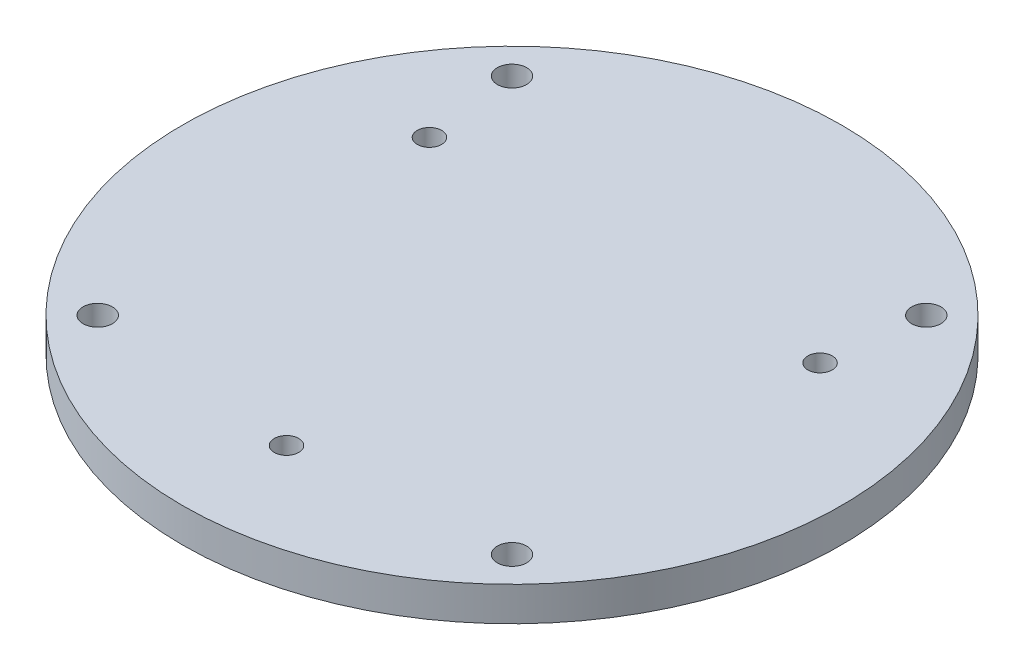
ISO-10303-21;
HEADER;
FILE_DESCRIPTION(('STEP AP214'),'2;1');
FILE_NAME('part.step','',(''),(''),'','','');
FILE_SCHEMA(('AUTOMOTIVE_DESIGN { 1 0 10303 214 1 1 1 1 }'));
ENDSEC;
DATA;
#1=APPLICATION_CONTEXT('core data for automotive mechanical design processes');
#2=APPLICATION_PROTOCOL_DEFINITION('international standard','automotive_design',2000,#1);
#3=PRODUCT_CONTEXT('',#1,'mechanical');
#4=PRODUCT('Part','Part','',(#3));
#5=PRODUCT_RELATED_PRODUCT_CATEGORY('part','',(#4));
#6=PRODUCT_DEFINITION_FORMATION('','',#4);
#7=PRODUCT_DEFINITION_CONTEXT('part definition',#1,'design');
#8=PRODUCT_DEFINITION('design','',#6,#7);
#9=PRODUCT_DEFINITION_SHAPE('','',#8);
#10=(LENGTH_UNIT() NAMED_UNIT(*) SI_UNIT(.MILLI.,.METRE.));
#11=(NAMED_UNIT(*) PLANE_ANGLE_UNIT() SI_UNIT($,.RADIAN.));
#12=(NAMED_UNIT(*) SI_UNIT($,.STERADIAN.) SOLID_ANGLE_UNIT());
#13=UNCERTAINTY_MEASURE_WITH_UNIT(LENGTH_MEASURE(1.E-05),#10,'distance_accuracy_value','');
#14=(GEOMETRIC_REPRESENTATION_CONTEXT(3) GLOBAL_UNCERTAINTY_ASSIGNED_CONTEXT((#13)) GLOBAL_UNIT_ASSIGNED_CONTEXT((#10,
#11,#12)) REPRESENTATION_CONTEXT('',''));
#15=CARTESIAN_POINT('',(0.,0.,0.));
#16=DIRECTION('',(0.,0.,1.));
#17=DIRECTION('',(1.,0.,0.));
#18=AXIS2_PLACEMENT_3D('',#15,#16,#17);
#19=CARTESIAN_POINT('',(0.,7.,0.));
#20=DIRECTION('',(0.,1.,0.));
#21=DIRECTION('',(0.,0.,1.));
#22=AXIS2_PLACEMENT_3D('',#19,#20,#21);
#23=PLANE('',#22);
#24=CARTESIAN_POINT('',(42.425,7.,42.425));
#25=DIRECTION('',(0.,1.,0.));
#26=DIRECTION('',(0.,0.,1.));
#27=AXIS2_PLACEMENT_3D('',#24,#25,#26);
#28=CIRCLE('',#27,3.);
#29=CARTESIAN_POINT('',(42.425,7.,45.425));
#30=VERTEX_POINT('',#29);
#31=EDGE_CURVE('E87',#30,#30,#28,.T.);
#32=ORIENTED_EDGE('',*,*,#31,.F.);
#33=EDGE_LOOP('',(#32));
#34=FACE_BOUND('',#33,.T.);
#35=CARTESIAN_POINT('',(-42.425,7.,42.425));
#36=DIRECTION('',(0.,1.,0.));
#37=DIRECTION('',(0.,0.,1.));
#38=AXIS2_PLACEMENT_3D('',#35,#36,#37);
#39=CIRCLE('',#38,3.);
#40=CARTESIAN_POINT('',(-42.425,7.,45.425));
#41=VERTEX_POINT('',#40);
#42=EDGE_CURVE('E84',#41,#41,#39,.T.);
#43=ORIENTED_EDGE('',*,*,#42,.F.);
#44=EDGE_LOOP('',(#43));
#45=FACE_BOUND('',#44,.T.);
#46=CARTESIAN_POINT('',(-42.425,7.,-42.425));
#47=DIRECTION('',(0.,1.,0.));
#48=DIRECTION('',(0.,0.,1.));
#49=AXIS2_PLACEMENT_3D('',#46,#47,#48);
#50=CIRCLE('',#49,3.);
#51=CARTESIAN_POINT('',(-42.425,7.,-39.425));
#52=VERTEX_POINT('',#51);
#53=EDGE_CURVE('E77',#52,#52,#50,.T.);
#54=ORIENTED_EDGE('',*,*,#53,.F.);
#55=EDGE_LOOP('',(#54));
#56=FACE_BOUND('',#55,.T.);
#57=CARTESIAN_POINT('',(42.425,7.,-42.425));
#58=DIRECTION('',(0.,1.,0.));
#59=DIRECTION('',(0.,0.,1.));
#60=AXIS2_PLACEMENT_3D('',#57,#58,#59);
#61=CIRCLE('',#60,3.);
#62=CARTESIAN_POINT('',(42.425,7.,-39.425));
#63=VERTEX_POINT('',#62);
#64=EDGE_CURVE('E73',#63,#63,#61,.T.);
#65=ORIENTED_EDGE('',*,*,#64,.F.);
#66=EDGE_LOOP('',(#65));
#67=FACE_BOUND('',#66,.T.);
#68=CARTESIAN_POINT('',(40.,7.,-23.0940107675853));
#69=DIRECTION('',(0.,1.,0.));
#70=DIRECTION('',(0.,0.,1.));
#71=AXIS2_PLACEMENT_3D('',#68,#69,#70);
#72=CIRCLE('',#71,2.5);
#73=CARTESIAN_POINT('',(40.,7.,-20.5940107675853));
#74=VERTEX_POINT('',#73);
#75=EDGE_CURVE('E62',#74,#74,#72,.T.);
#76=ORIENTED_EDGE('',*,*,#75,.F.);
#77=EDGE_LOOP('',(#76));
#78=FACE_BOUND('',#77,.T.);
#79=CARTESIAN_POINT('',(0.,7.,0.));
#80=DIRECTION('',(0.,1.,0.));
#81=DIRECTION('',(0.,0.,1.));
#82=AXIS2_PLACEMENT_3D('',#79,#80,#81);
#83=CIRCLE('',#82,67.5);
#84=CARTESIAN_POINT('',(0.,7.,67.5));
#85=VERTEX_POINT('',#84);
#86=EDGE_CURVE('E11',#85,#85,#83,.T.);
#87=ORIENTED_EDGE('',*,*,#86,.T.);
#88=EDGE_LOOP('',(#87));
#89=FACE_BOUND('',#88,.T.);
#90=CARTESIAN_POINT('',(-40.,7.,-23.0940107675853));
#91=DIRECTION('',(0.,1.,0.));
#92=DIRECTION('',(0.,0.,1.));
#93=AXIS2_PLACEMENT_3D('',#90,#91,#92);
#94=CIRCLE('',#93,2.5);
#95=CARTESIAN_POINT('',(-40.,7.,-20.5940107675853));
#96=VERTEX_POINT('',#95);
#97=EDGE_CURVE('E46',#96,#96,#94,.T.);
#98=ORIENTED_EDGE('',*,*,#97,.F.);
#99=EDGE_LOOP('',(#98));
#100=FACE_BOUND('',#99,.T.);
#101=CARTESIAN_POINT('',(0.,7.,46.1880215351698));
#102=DIRECTION('',(0.,1.,0.));
#103=DIRECTION('',(0.,0.,1.));
#104=AXIS2_PLACEMENT_3D('',#101,#102,#103);
#105=CIRCLE('',#104,2.5);
#106=CARTESIAN_POINT('',(0.,7.,48.6880215351698));
#107=VERTEX_POINT('',#106);
#108=EDGE_CURVE('E63',#107,#107,#105,.T.);
#109=ORIENTED_EDGE('',*,*,#108,.F.);
#110=EDGE_LOOP('',(#109));
#111=FACE_BOUND('',#110,.T.);
#112=ADVANCED_FACE('F33',(#34,#45,#56,#67,#78,#89,#100,#111),#23,.T.);
#113=CARTESIAN_POINT('',(0.,0.,0.));
#114=DIRECTION('',(0.,1.,0.));
#115=DIRECTION('',(0.,0.,1.));
#116=AXIS2_PLACEMENT_3D('',#113,#114,#115);
#117=PLANE('',#116);
#118=CARTESIAN_POINT('',(42.425,0.,42.425));
#119=DIRECTION('',(0.,1.,0.));
#120=DIRECTION('',(0.,0.,1.));
#121=AXIS2_PLACEMENT_3D('',#118,#119,#120);
#122=CIRCLE('',#121,3.);
#123=CARTESIAN_POINT('',(42.425,0.,45.425));
#124=VERTEX_POINT('',#123);
#125=EDGE_CURVE('E37',#124,#124,#122,.T.);
#126=ORIENTED_EDGE('',*,*,#125,.T.);
#127=EDGE_LOOP('',(#126));
#128=FACE_BOUND('',#127,.T.);
#129=CARTESIAN_POINT('',(-42.425,0.,42.425));
#130=DIRECTION('',(0.,1.,0.));
#131=DIRECTION('',(0.,0.,1.));
#132=AXIS2_PLACEMENT_3D('',#129,#130,#131);
#133=CIRCLE('',#132,3.);
#134=CARTESIAN_POINT('',(-42.425,0.,45.425));
#135=VERTEX_POINT('',#134);
#136=EDGE_CURVE('E94',#135,#135,#133,.T.);
#137=ORIENTED_EDGE('',*,*,#136,.T.);
#138=EDGE_LOOP('',(#137));
#139=FACE_BOUND('',#138,.T.);
#140=CARTESIAN_POINT('',(-42.425,0.,-42.425));
#141=DIRECTION('',(0.,1.,0.));
#142=DIRECTION('',(0.,0.,1.));
#143=AXIS2_PLACEMENT_3D('',#140,#141,#142);
#144=CIRCLE('',#143,3.);
#145=CARTESIAN_POINT('',(-42.425,0.,-39.425));
#146=VERTEX_POINT('',#145);
#147=EDGE_CURVE('E90',#146,#146,#144,.T.);
#148=ORIENTED_EDGE('',*,*,#147,.T.);
#149=EDGE_LOOP('',(#148));
#150=FACE_BOUND('',#149,.T.);
#151=CARTESIAN_POINT('',(42.425,0.,-42.425));
#152=DIRECTION('',(0.,1.,0.));
#153=DIRECTION('',(0.,0.,1.));
#154=AXIS2_PLACEMENT_3D('',#151,#152,#153);
#155=CIRCLE('',#154,3.);
#156=CARTESIAN_POINT('',(42.425,0.,-39.425));
#157=VERTEX_POINT('',#156);
#158=EDGE_CURVE('E69',#157,#157,#155,.T.);
#159=ORIENTED_EDGE('',*,*,#158,.T.);
#160=EDGE_LOOP('',(#159));
#161=FACE_BOUND('',#160,.T.);
#162=CARTESIAN_POINT('',(0.,0.,0.));
#163=DIRECTION('',(0.,1.,0.));
#164=DIRECTION('',(0.,0.,1.));
#165=AXIS2_PLACEMENT_3D('',#162,#163,#164);
#166=CIRCLE('',#165,67.5);
#167=CARTESIAN_POINT('',(0.,0.,67.5));
#168=VERTEX_POINT('',#167);
#169=EDGE_CURVE('E41',#168,#168,#166,.T.);
#170=ORIENTED_EDGE('',*,*,#169,.F.);
#171=EDGE_LOOP('',(#170));
#172=FACE_BOUND('',#171,.T.);
#173=CARTESIAN_POINT('',(-40.,0.,-23.0940107675853));
#174=DIRECTION('',(0.,1.,0.));
#175=DIRECTION('',(0.,0.,1.));
#176=AXIS2_PLACEMENT_3D('',#173,#174,#175);
#177=CIRCLE('',#176,2.5);
#178=CARTESIAN_POINT('',(-40.,0.,-20.5940107675853));
#179=VERTEX_POINT('',#178);
#180=EDGE_CURVE('E50',#179,#179,#177,.T.);
#181=ORIENTED_EDGE('',*,*,#180,.T.);
#182=EDGE_LOOP('',(#181));
#183=FACE_BOUND('',#182,.T.);
#184=CARTESIAN_POINT('',(40.,0.,-23.0940107675853));
#185=DIRECTION('',(0.,1.,0.));
#186=DIRECTION('',(0.,0.,1.));
#187=AXIS2_PLACEMENT_3D('',#184,#185,#186);
#188=CIRCLE('',#187,2.5);
#189=CARTESIAN_POINT('',(40.,0.,-20.5940107675853));
#190=VERTEX_POINT('',#189);
#191=EDGE_CURVE('E60',#190,#190,#188,.T.);
#192=ORIENTED_EDGE('',*,*,#191,.T.);
#193=EDGE_LOOP('',(#192));
#194=FACE_BOUND('',#193,.T.);
#195=CARTESIAN_POINT('',(0.,0.,46.1880215351698));
#196=DIRECTION('',(0.,1.,0.));
#197=DIRECTION('',(0.,0.,1.));
#198=AXIS2_PLACEMENT_3D('',#195,#196,#197);
#199=CIRCLE('',#198,2.5);
#200=CARTESIAN_POINT('',(0.,0.,48.6880215351698));
#201=VERTEX_POINT('',#200);
#202=EDGE_CURVE('E67',#201,#201,#199,.T.);
#203=ORIENTED_EDGE('',*,*,#202,.T.);
#204=EDGE_LOOP('',(#203));
#205=FACE_BOUND('',#204,.T.);
#206=ADVANCED_FACE('F102',(#128,#139,#150,#161,#172,#183,#194,#205),#117,.F.);
#207=CARTESIAN_POINT('',(0.,7.,0.));
#208=DIRECTION('',(0.,-1.,0.));
#209=DIRECTION('',(0.,0.,-1.));
#210=AXIS2_PLACEMENT_3D('',#207,#208,#209);
#211=CYLINDRICAL_SURFACE('',#210,67.5);
#212=ORIENTED_EDGE('',*,*,#86,.F.);
#213=EDGE_LOOP('',(#212));
#214=FACE_BOUND('',#213,.T.);
#215=ORIENTED_EDGE('',*,*,#169,.T.);
#216=EDGE_LOOP('',(#215));
#217=FACE_BOUND('',#216,.T.);
#218=ADVANCED_FACE('F35',(#214,#217),#211,.T.);
#219=CARTESIAN_POINT('',(-40.,7.,-23.0940107675853));
#220=DIRECTION('',(0.,-1.,0.));
#221=DIRECTION('',(0.,0.,-1.));
#222=AXIS2_PLACEMENT_3D('',#219,#220,#221);
#223=CYLINDRICAL_SURFACE('',#222,2.5);
#224=ORIENTED_EDGE('',*,*,#97,.T.);
#225=EDGE_LOOP('',(#224));
#226=FACE_BOUND('',#225,.T.);
#227=ORIENTED_EDGE('',*,*,#180,.F.);
#228=EDGE_LOOP('',(#227));
#229=FACE_BOUND('',#228,.T.);
#230=ADVANCED_FACE('F130',(#226,#229),#223,.F.);
#231=CARTESIAN_POINT('',(40.,7.,-23.0940107675853));
#232=DIRECTION('',(0.,-1.,0.));
#233=DIRECTION('',(0.,0.,-1.));
#234=AXIS2_PLACEMENT_3D('',#231,#232,#233);
#235=CYLINDRICAL_SURFACE('',#234,2.5);
#236=ORIENTED_EDGE('',*,*,#75,.T.);
#237=EDGE_LOOP('',(#236));
#238=FACE_BOUND('',#237,.T.);
#239=ORIENTED_EDGE('',*,*,#191,.F.);
#240=EDGE_LOOP('',(#239));
#241=FACE_BOUND('',#240,.T.);
#242=ADVANCED_FACE('F118',(#238,#241),#235,.F.);
#243=CARTESIAN_POINT('',(0.,7.,46.1880215351698));
#244=DIRECTION('',(0.,-1.,0.));
#245=DIRECTION('',(0.,0.,-1.));
#246=AXIS2_PLACEMENT_3D('',#243,#244,#245);
#247=CYLINDRICAL_SURFACE('',#246,2.5);
#248=ORIENTED_EDGE('',*,*,#108,.T.);
#249=EDGE_LOOP('',(#248));
#250=FACE_BOUND('',#249,.T.);
#251=ORIENTED_EDGE('',*,*,#202,.F.);
#252=EDGE_LOOP('',(#251));
#253=FACE_BOUND('',#252,.T.);
#254=ADVANCED_FACE('F108',(#250,#253),#247,.F.);
#255=CARTESIAN_POINT('',(42.425,-3.,-42.425));
#256=DIRECTION('',(0.,1.,0.));
#257=DIRECTION('',(0.,0.,1.));
#258=AXIS2_PLACEMENT_3D('',#255,#256,#257);
#259=CYLINDRICAL_SURFACE('',#258,3.);
#260=ORIENTED_EDGE('',*,*,#64,.T.);
#261=EDGE_LOOP('',(#260));
#262=FACE_BOUND('',#261,.T.);
#263=ORIENTED_EDGE('',*,*,#158,.F.);
#264=EDGE_LOOP('',(#263));
#265=FACE_BOUND('',#264,.T.);
#266=ADVANCED_FACE('F105',(#262,#265),#259,.F.);
#267=CARTESIAN_POINT('',(-42.425,-3.,-42.425));
#268=DIRECTION('',(0.,1.,0.));
#269=DIRECTION('',(0.,0.,1.));
#270=AXIS2_PLACEMENT_3D('',#267,#268,#269);
#271=CYLINDRICAL_SURFACE('',#270,3.);
#272=ORIENTED_EDGE('',*,*,#53,.T.);
#273=EDGE_LOOP('',(#272));
#274=FACE_BOUND('',#273,.T.);
#275=ORIENTED_EDGE('',*,*,#147,.F.);
#276=EDGE_LOOP('',(#275));
#277=FACE_BOUND('',#276,.T.);
#278=ADVANCED_FACE('F107',(#274,#277),#271,.F.);
#279=CARTESIAN_POINT('',(-42.425,-3.,42.425));
#280=DIRECTION('',(0.,1.,0.));
#281=DIRECTION('',(0.,0.,1.));
#282=AXIS2_PLACEMENT_3D('',#279,#280,#281);
#283=CYLINDRICAL_SURFACE('',#282,3.);
#284=ORIENTED_EDGE('',*,*,#42,.T.);
#285=EDGE_LOOP('',(#284));
#286=FACE_BOUND('',#285,.T.);
#287=ORIENTED_EDGE('',*,*,#136,.F.);
#288=EDGE_LOOP('',(#287));
#289=FACE_BOUND('',#288,.T.);
#290=ADVANCED_FACE('F115',(#286,#289),#283,.F.);
#291=CARTESIAN_POINT('',(42.425,-3.,42.425));
#292=DIRECTION('',(0.,1.,0.));
#293=DIRECTION('',(0.,0.,1.));
#294=AXIS2_PLACEMENT_3D('',#291,#292,#293);
#295=CYLINDRICAL_SURFACE('',#294,3.);
#296=ORIENTED_EDGE('',*,*,#31,.T.);
#297=EDGE_LOOP('',(#296));
#298=FACE_BOUND('',#297,.T.);
#299=ORIENTED_EDGE('',*,*,#125,.F.);
#300=EDGE_LOOP('',(#299));
#301=FACE_BOUND('',#300,.T.);
#302=ADVANCED_FACE('F191',(#298,#301),#295,.F.);
#303=CLOSED_SHELL('',(#112,#206,#218,#230,#242,#254,#266,#278,#290,#302));
#304=MANIFOLD_SOLID_BREP('B2',#303);
#305=ADVANCED_BREP_SHAPE_REPRESENTATION('',(#18,#304),#14);
#306=SHAPE_DEFINITION_REPRESENTATION(#9,#305);
ENDSEC;
END-ISO-10303-21;
